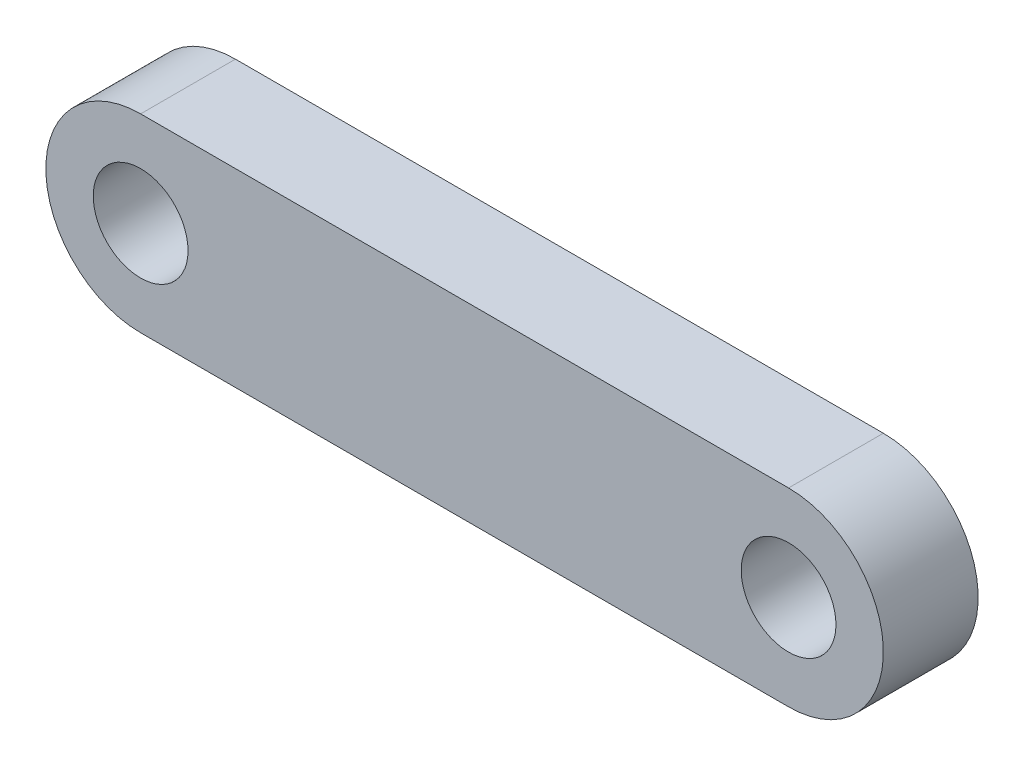
ISO-10303-21;
HEADER;
FILE_DESCRIPTION(('STEP AP214'),'2;1');
FILE_NAME('part.step','',(''),(''),'','','');
FILE_SCHEMA(('AUTOMOTIVE_DESIGN { 1 0 10303 214 1 1 1 1 }'));
ENDSEC;
DATA;
#1=APPLICATION_CONTEXT('core data for automotive mechanical design processes');
#2=APPLICATION_PROTOCOL_DEFINITION('international standard','automotive_design',2000,#1);
#3=PRODUCT_CONTEXT('',#1,'mechanical');
#4=PRODUCT('Part','Part','',(#3));
#5=PRODUCT_RELATED_PRODUCT_CATEGORY('part','',(#4));
#6=PRODUCT_DEFINITION_FORMATION('','',#4);
#7=PRODUCT_DEFINITION_CONTEXT('part definition',#1,'design');
#8=PRODUCT_DEFINITION('design','',#6,#7);
#9=PRODUCT_DEFINITION_SHAPE('','',#8);
#10=(LENGTH_UNIT() NAMED_UNIT(*) SI_UNIT(.MILLI.,.METRE.));
#11=(NAMED_UNIT(*) PLANE_ANGLE_UNIT() SI_UNIT($,.RADIAN.));
#12=(NAMED_UNIT(*) SI_UNIT($,.STERADIAN.) SOLID_ANGLE_UNIT());
#13=UNCERTAINTY_MEASURE_WITH_UNIT(LENGTH_MEASURE(1.E-05),#10,'distance_accuracy_value','');
#14=(GEOMETRIC_REPRESENTATION_CONTEXT(3) GLOBAL_UNCERTAINTY_ASSIGNED_CONTEXT((#13)) GLOBAL_UNIT_ASSIGNED_CONTEXT((#10,
#11,#12)) REPRESENTATION_CONTEXT('',''));
#15=CARTESIAN_POINT('',(0.,0.,0.));
#16=DIRECTION('',(0.,0.,1.));
#17=DIRECTION('',(1.,0.,0.));
#18=AXIS2_PLACEMENT_3D('',#15,#16,#17);
#19=CARTESIAN_POINT('',(0.,0.,10.));
#20=DIRECTION('',(0.,0.,-1.));
#21=DIRECTION('',(-1.,0.,0.));
#22=AXIS2_PLACEMENT_3D('',#19,#20,#21);
#23=CYLINDRICAL_SURFACE('',#22,10.);
#24=CARTESIAN_POINT('',(0.,0.,0.));
#25=DIRECTION('',(0.,0.,1.));
#26=DIRECTION('',(1.,0.,0.));
#27=AXIS2_PLACEMENT_3D('',#24,#25,#26);
#28=CIRCLE('',#27,10.);
#29=CARTESIAN_POINT('',(0.,10.,0.));
#30=VERTEX_POINT('',#29);
#31=CARTESIAN_POINT('',(0.,-10.,0.));
#32=VERTEX_POINT('',#31);
#33=EDGE_CURVE('E99',#30,#32,#28,.T.);
#34=ORIENTED_EDGE('',*,*,#33,.T.);
#35=DIRECTION('',(0.,0.,-1.));
#36=VECTOR('',#35,1.);
#37=CARTESIAN_POINT('',(0.,-10.,10.));
#38=LINE('',#37,#36);
#39=CARTESIAN_POINT('',(0.,-10.,10.));
#40=VERTEX_POINT('',#39);
#41=EDGE_CURVE('E11',#40,#32,#38,.T.);
#42=ORIENTED_EDGE('',*,*,#41,.F.);
#43=CARTESIAN_POINT('',(0.,0.,10.));
#44=DIRECTION('',(0.,0.,1.));
#45=DIRECTION('',(1.,0.,0.));
#46=AXIS2_PLACEMENT_3D('',#43,#44,#45);
#47=CIRCLE('',#46,10.);
#48=CARTESIAN_POINT('',(0.,10.,10.));
#49=VERTEX_POINT('',#48);
#50=EDGE_CURVE('E87',#49,#40,#47,.T.);
#51=ORIENTED_EDGE('',*,*,#50,.F.);
#52=DIRECTION('',(0.,0.,-1.));
#53=VECTOR('',#52,1.);
#54=CARTESIAN_POINT('',(0.,10.,10.));
#55=LINE('',#54,#53);
#56=EDGE_CURVE('E95',#49,#30,#55,.T.);
#57=ORIENTED_EDGE('',*,*,#56,.T.);
#58=EDGE_LOOP('',(#34,#42,#51,#57));
#59=FACE_BOUND('',#58,.T.);
#60=ADVANCED_FACE('F36',(#59),#23,.T.);
#61=CARTESIAN_POINT('',(0.,-10.,10.));
#62=DIRECTION('',(0.,1.,0.));
#63=DIRECTION('',(0.,0.,1.));
#64=AXIS2_PLACEMENT_3D('',#61,#62,#63);
#65=PLANE('',#64);
#66=DIRECTION('',(1.,0.,0.));
#67=VECTOR('',#66,1.);
#68=CARTESIAN_POINT('',(0.,-10.,0.));
#69=LINE('',#68,#67);
#70=CARTESIAN_POINT('',(68.35,-10.,0.));
#71=VERTEX_POINT('',#70);
#72=EDGE_CURVE('E91',#32,#71,#69,.T.);
#73=ORIENTED_EDGE('',*,*,#72,.T.);
#74=DIRECTION('',(0.,0.,-1.));
#75=VECTOR('',#74,1.);
#76=CARTESIAN_POINT('',(68.35,-10.,10.));
#77=LINE('',#76,#75);
#78=CARTESIAN_POINT('',(68.35,-10.,10.));
#79=VERTEX_POINT('',#78);
#80=EDGE_CURVE('E44',#79,#71,#77,.T.);
#81=ORIENTED_EDGE('',*,*,#80,.F.);
#82=DIRECTION('',(1.,0.,0.));
#83=VECTOR('',#82,1.);
#84=CARTESIAN_POINT('',(0.,-10.,10.));
#85=LINE('',#84,#83);
#86=EDGE_CURVE('E82',#40,#79,#85,.T.);
#87=ORIENTED_EDGE('',*,*,#86,.F.);
#88=ORIENTED_EDGE('',*,*,#41,.T.);
#89=EDGE_LOOP('',(#73,#81,#87,#88));
#90=FACE_BOUND('',#89,.T.);
#91=ADVANCED_FACE('F90',(#90),#65,.F.);
#92=CARTESIAN_POINT('',(68.35,0.,10.));
#93=DIRECTION('',(0.,0.,-1.));
#94=DIRECTION('',(-1.,0.,0.));
#95=AXIS2_PLACEMENT_3D('',#92,#93,#94);
#96=CYLINDRICAL_SURFACE('',#95,10.);
#97=CARTESIAN_POINT('',(68.35,0.,0.));
#98=DIRECTION('',(0.,0.,1.));
#99=DIRECTION('',(-1.,0.,0.));
#100=AXIS2_PLACEMENT_3D('',#97,#98,#99);
#101=CIRCLE('',#100,10.);
#102=CARTESIAN_POINT('',(68.35,10.,0.));
#103=VERTEX_POINT('',#102);
#104=EDGE_CURVE('E69',#71,#103,#101,.T.);
#105=ORIENTED_EDGE('',*,*,#104,.T.);
#106=DIRECTION('',(0.,0.,-1.));
#107=VECTOR('',#106,1.);
#108=CARTESIAN_POINT('',(68.35,10.,10.));
#109=LINE('',#108,#107);
#110=CARTESIAN_POINT('',(68.35,10.,10.));
#111=VERTEX_POINT('',#110);
#112=EDGE_CURVE('E92',#111,#103,#109,.T.);
#113=ORIENTED_EDGE('',*,*,#112,.F.);
#114=CARTESIAN_POINT('',(68.35,0.,10.));
#115=DIRECTION('',(0.,0.,1.));
#116=DIRECTION('',(-1.,0.,0.));
#117=AXIS2_PLACEMENT_3D('',#114,#115,#116);
#118=CIRCLE('',#117,10.);
#119=EDGE_CURVE('E85',#79,#111,#118,.T.);
#120=ORIENTED_EDGE('',*,*,#119,.F.);
#121=ORIENTED_EDGE('',*,*,#80,.T.);
#122=EDGE_LOOP('',(#105,#113,#120,#121));
#123=FACE_BOUND('',#122,.T.);
#124=ADVANCED_FACE('F93',(#123),#96,.T.);
#125=CARTESIAN_POINT('',(0.,10.,10.));
#126=DIRECTION('',(0.,-1.,0.));
#127=DIRECTION('',(0.,0.,-1.));
#128=AXIS2_PLACEMENT_3D('',#125,#126,#127);
#129=PLANE('',#128);
#130=DIRECTION('',(-1.,0.,0.));
#131=VECTOR('',#130,1.);
#132=CARTESIAN_POINT('',(0.,10.,0.));
#133=LINE('',#132,#131);
#134=EDGE_CURVE('E75',#103,#30,#133,.T.);
#135=ORIENTED_EDGE('',*,*,#134,.T.);
#136=ORIENTED_EDGE('',*,*,#56,.F.);
#137=DIRECTION('',(-1.,0.,0.));
#138=VECTOR('',#137,1.);
#139=CARTESIAN_POINT('',(0.,10.,10.));
#140=LINE('',#139,#138);
#141=EDGE_CURVE('E52',#111,#49,#140,.T.);
#142=ORIENTED_EDGE('',*,*,#141,.F.);
#143=ORIENTED_EDGE('',*,*,#112,.T.);
#144=EDGE_LOOP('',(#135,#136,#142,#143));
#145=FACE_BOUND('',#144,.T.);
#146=ADVANCED_FACE('F107',(#145),#129,.F.);
#147=CARTESIAN_POINT('',(0.,0.,10.));
#148=DIRECTION('',(0.,0.,1.));
#149=DIRECTION('',(1.,0.,0.));
#150=AXIS2_PLACEMENT_3D('',#147,#148,#149);
#151=PLANE('',#150);
#152=CARTESIAN_POINT('',(68.35,0.,10.));
#153=DIRECTION('',(0.,0.,1.));
#154=DIRECTION('',(1.,0.,0.));
#155=AXIS2_PLACEMENT_3D('',#152,#153,#154);
#156=CIRCLE('',#155,5.);
#157=CARTESIAN_POINT('',(73.35,0.,10.));
#158=VERTEX_POINT('',#157);
#159=EDGE_CURVE('E119',#158,#158,#156,.T.);
#160=ORIENTED_EDGE('',*,*,#159,.F.);
#161=EDGE_LOOP('',(#160));
#162=FACE_BOUND('',#161,.T.);
#163=CARTESIAN_POINT('',(0.,0.,10.));
#164=DIRECTION('',(0.,0.,1.));
#165=DIRECTION('',(1.,0.,0.));
#166=AXIS2_PLACEMENT_3D('',#163,#164,#165);
#167=CIRCLE('',#166,5.);
#168=CARTESIAN_POINT('',(5.,0.,10.));
#169=VERTEX_POINT('',#168);
#170=EDGE_CURVE('E113',#169,#169,#167,.T.);
#171=ORIENTED_EDGE('',*,*,#170,.F.);
#172=EDGE_LOOP('',(#171));
#173=FACE_BOUND('',#172,.T.);
#174=ORIENTED_EDGE('',*,*,#50,.T.);
#175=ORIENTED_EDGE('',*,*,#86,.T.);
#176=ORIENTED_EDGE('',*,*,#119,.T.);
#177=ORIENTED_EDGE('',*,*,#141,.T.);
#178=EDGE_LOOP('',(#174,#175,#176,#177));
#179=FACE_BOUND('',#178,.T.);
#180=ADVANCED_FACE('F83',(#162,#173,#179),#151,.T.);
#181=CARTESIAN_POINT('',(0.,0.,0.));
#182=DIRECTION('',(0.,0.,1.));
#183=DIRECTION('',(1.,0.,0.));
#184=AXIS2_PLACEMENT_3D('',#181,#182,#183);
#185=PLANE('',#184);
#186=CARTESIAN_POINT('',(68.35,0.,0.));
#187=DIRECTION('',(0.,0.,1.));
#188=DIRECTION('',(1.,0.,0.));
#189=AXIS2_PLACEMENT_3D('',#186,#187,#188);
#190=CIRCLE('',#189,5.);
#191=CARTESIAN_POINT('',(73.35,0.,0.));
#192=VERTEX_POINT('',#191);
#193=EDGE_CURVE('E116',#192,#192,#190,.T.);
#194=ORIENTED_EDGE('',*,*,#193,.T.);
#195=EDGE_LOOP('',(#194));
#196=FACE_BOUND('',#195,.T.);
#197=CARTESIAN_POINT('',(0.,0.,0.));
#198=DIRECTION('',(0.,0.,1.));
#199=DIRECTION('',(1.,0.,0.));
#200=AXIS2_PLACEMENT_3D('',#197,#198,#199);
#201=CIRCLE('',#200,5.);
#202=CARTESIAN_POINT('',(5.,0.,0.));
#203=VERTEX_POINT('',#202);
#204=EDGE_CURVE('E102',#203,#203,#201,.T.);
#205=ORIENTED_EDGE('',*,*,#204,.T.);
#206=EDGE_LOOP('',(#205));
#207=FACE_BOUND('',#206,.T.);
#208=ORIENTED_EDGE('',*,*,#33,.F.);
#209=ORIENTED_EDGE('',*,*,#134,.F.);
#210=ORIENTED_EDGE('',*,*,#104,.F.);
#211=ORIENTED_EDGE('',*,*,#72,.F.);
#212=EDGE_LOOP('',(#208,#209,#210,#211));
#213=FACE_BOUND('',#212,.T.);
#214=ADVANCED_FACE('F110',(#196,#207,#213),#185,.F.);
#215=CARTESIAN_POINT('',(0.,0.,0.));
#216=DIRECTION('',(0.,0.,1.));
#217=DIRECTION('',(1.,0.,0.));
#218=AXIS2_PLACEMENT_3D('',#215,#216,#217);
#219=CYLINDRICAL_SURFACE('',#218,5.);
#220=ORIENTED_EDGE('',*,*,#204,.F.);
#221=EDGE_LOOP('',(#220));
#222=FACE_BOUND('',#221,.T.);
#223=ORIENTED_EDGE('',*,*,#170,.T.);
#224=EDGE_LOOP('',(#223));
#225=FACE_BOUND('',#224,.T.);
#226=ADVANCED_FACE('F130',(#222,#225),#219,.F.);
#227=CARTESIAN_POINT('',(68.35,0.,0.));
#228=DIRECTION('',(0.,0.,1.));
#229=DIRECTION('',(1.,0.,0.));
#230=AXIS2_PLACEMENT_3D('',#227,#228,#229);
#231=CYLINDRICAL_SURFACE('',#230,5.);
#232=ORIENTED_EDGE('',*,*,#193,.F.);
#233=EDGE_LOOP('',(#232));
#234=FACE_BOUND('',#233,.T.);
#235=ORIENTED_EDGE('',*,*,#159,.T.);
#236=EDGE_LOOP('',(#235));
#237=FACE_BOUND('',#236,.T.);
#238=ADVANCED_FACE('F127',(#234,#237),#231,.F.);
#239=CLOSED_SHELL('',(#60,#91,#124,#146,#180,#214,#226,#238));
#240=MANIFOLD_SOLID_BREP('B2',#239);
#241=ADVANCED_BREP_SHAPE_REPRESENTATION('',(#18,#240),#14);
#242=SHAPE_DEFINITION_REPRESENTATION(#9,#241);
ENDSEC;
END-ISO-10303-21;
